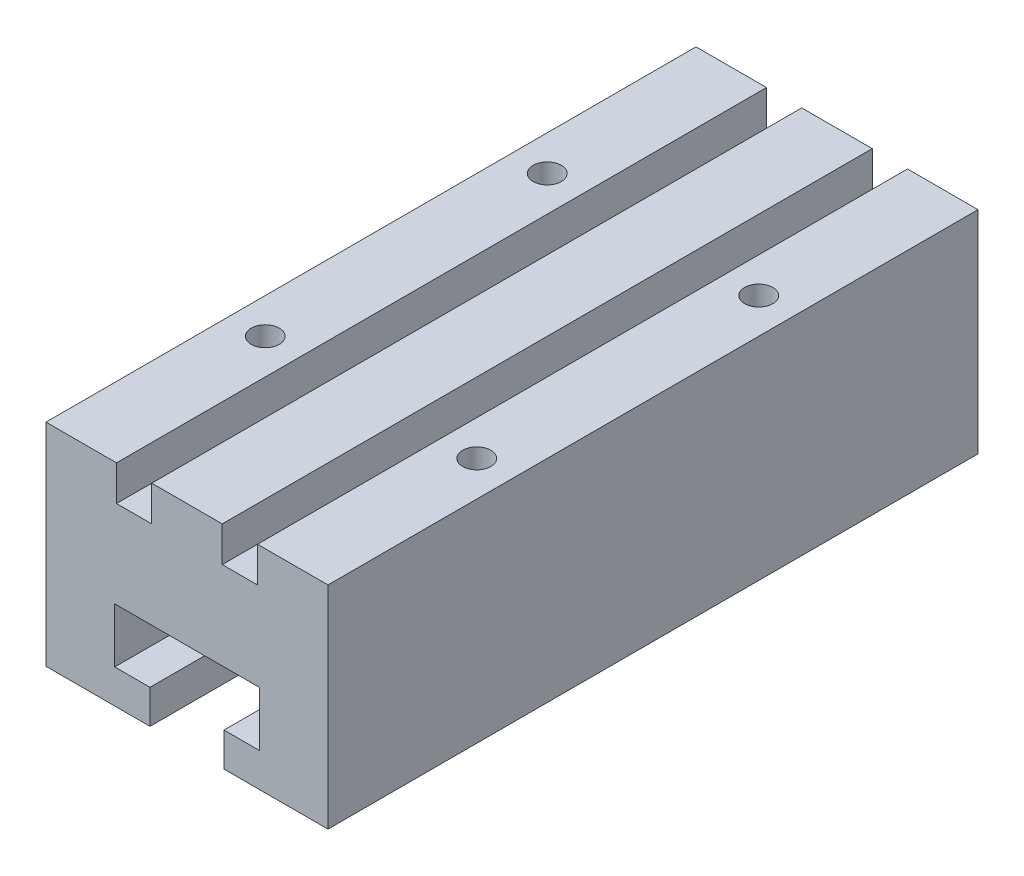
ISO-10303-21;
HEADER;
FILE_DESCRIPTION(('STEP AP214'),'2;1');
FILE_NAME('part.step','',(''),(''),'','','');
FILE_SCHEMA(('AUTOMOTIVE_DESIGN { 1 0 10303 214 1 1 1 1 }'));
ENDSEC;
DATA;
#1=APPLICATION_CONTEXT('core data for automotive mechanical design processes');
#2=APPLICATION_PROTOCOL_DEFINITION('international standard','automotive_design',2000,#1);
#3=PRODUCT_CONTEXT('',#1,'mechanical');
#4=PRODUCT('Part','Part','',(#3));
#5=PRODUCT_RELATED_PRODUCT_CATEGORY('part','',(#4));
#6=PRODUCT_DEFINITION_FORMATION('','',#4);
#7=PRODUCT_DEFINITION_CONTEXT('part definition',#1,'design');
#8=PRODUCT_DEFINITION('design','',#6,#7);
#9=PRODUCT_DEFINITION_SHAPE('','',#8);
#10=(LENGTH_UNIT() NAMED_UNIT(*) SI_UNIT(.MILLI.,.METRE.));
#11=(NAMED_UNIT(*) PLANE_ANGLE_UNIT() SI_UNIT($,.RADIAN.));
#12=(NAMED_UNIT(*) SI_UNIT($,.STERADIAN.) SOLID_ANGLE_UNIT());
#13=UNCERTAINTY_MEASURE_WITH_UNIT(LENGTH_MEASURE(1.E-05),#10,'distance_accuracy_value','');
#14=(GEOMETRIC_REPRESENTATION_CONTEXT(3) GLOBAL_UNCERTAINTY_ASSIGNED_CONTEXT((#13)) GLOBAL_UNIT_ASSIGNED_CONTEXT((#10,
#11,#12)) REPRESENTATION_CONTEXT('',''));
#15=CARTESIAN_POINT('',(0.,0.,0.));
#16=DIRECTION('',(0.,0.,1.));
#17=DIRECTION('',(1.,0.,0.));
#18=AXIS2_PLACEMENT_3D('',#15,#16,#17);
#19=CARTESIAN_POINT('',(-20.,15.,92.2));
#20=DIRECTION('',(0.,-1.,0.));
#21=DIRECTION('',(0.,0.,-1.));
#22=AXIS2_PLACEMENT_3D('',#19,#20,#21);
#23=PLANE('',#22);
#24=DIRECTION('',(-1.,0.,0.));
#25=VECTOR('',#24,1.);
#26=CARTESIAN_POINT('',(-20.,15.,0.));
#27=LINE('',#26,#25);
#28=CARTESIAN_POINT('',(5.,15.,0.));
#29=VERTEX_POINT('',#28);
#30=CARTESIAN_POINT('',(-5.,15.,0.));
#31=VERTEX_POINT('',#30);
#32=EDGE_CURVE('E311',#29,#31,#27,.T.);
#33=ORIENTED_EDGE('',*,*,#32,.T.);
#34=DIRECTION('',(0.,0.,-1.));
#35=VECTOR('',#34,1.);
#36=CARTESIAN_POINT('',(-4.99999999999999,15.,92.2));
#37=LINE('',#36,#35);
#38=CARTESIAN_POINT('',(-4.99999999999999,15.,92.2));
#39=VERTEX_POINT('',#38);
#40=EDGE_CURVE('E222',#39,#31,#37,.T.);
#41=ORIENTED_EDGE('',*,*,#40,.F.);
#42=DIRECTION('',(-1.,0.,0.));
#43=VECTOR('',#42,1.);
#44=CARTESIAN_POINT('',(-20.,15.,92.2));
#45=LINE('',#44,#43);
#46=CARTESIAN_POINT('',(5.00000000000001,15.,92.2));
#47=VERTEX_POINT('',#46);
#48=EDGE_CURVE('E298',#47,#39,#45,.T.);
#49=ORIENTED_EDGE('',*,*,#48,.F.);
#50=DIRECTION('',(0.,0.,1.));
#51=VECTOR('',#50,1.);
#52=CARTESIAN_POINT('',(5.,15.,0.));
#53=LINE('',#52,#51);
#54=EDGE_CURVE('E216',#29,#47,#53,.T.);
#55=ORIENTED_EDGE('',*,*,#54,.F.);
#56=EDGE_LOOP('',(#33,#41,#49,#55));
#57=FACE_BOUND('',#56,.T.);
#58=ADVANCED_FACE('F41',(#57),#23,.F.);
#59=CARTESIAN_POINT('',(-15.,15.,66.1));
#60=DIRECTION('',(0.,1.,0.));
#61=DIRECTION('',(0.,0.,1.));
#62=AXIS2_PLACEMENT_3D('',#59,#60,#61);
#63=CIRCLE('',#62,2.);
#64=CARTESIAN_POINT('',(-15.,15.,68.1));
#65=VERTEX_POINT('',#64);
#66=EDGE_CURVE('E372',#65,#65,#63,.T.);
#67=ORIENTED_EDGE('',*,*,#66,.F.);
#68=EDGE_LOOP('',(#67));
#69=FACE_BOUND('',#68,.T.);
#70=CARTESIAN_POINT('',(-15.,15.,26.1));
#71=DIRECTION('',(0.,1.,0.));
#72=DIRECTION('',(0.,0.,1.));
#73=AXIS2_PLACEMENT_3D('',#70,#71,#72);
#74=CIRCLE('',#73,2.);
#75=CARTESIAN_POINT('',(-15.,15.,28.1));
#76=VERTEX_POINT('',#75);
#77=EDGE_CURVE('E354',#76,#76,#74,.T.);
#78=ORIENTED_EDGE('',*,*,#77,.F.);
#79=EDGE_LOOP('',(#78));
#80=FACE_BOUND('',#79,.T.);
#81=CARTESIAN_POINT('',(-10.,15.,92.2));
#82=VERTEX_POINT('',#81);
#83=CARTESIAN_POINT('',(-20.,15.,92.2));
#84=VERTEX_POINT('',#83);
#85=EDGE_CURVE('E292',#82,#84,#45,.T.);
#86=ORIENTED_EDGE('',*,*,#85,.F.);
#87=DIRECTION('',(0.,0.,1.));
#88=VECTOR('',#87,1.);
#89=CARTESIAN_POINT('',(-10.,15.,92.2));
#90=LINE('',#89,#88);
#91=CARTESIAN_POINT('',(-10.,15.,0.));
#92=VERTEX_POINT('',#91);
#93=EDGE_CURVE('E347',#92,#82,#90,.T.);
#94=ORIENTED_EDGE('',*,*,#93,.F.);
#95=CARTESIAN_POINT('',(-20.,15.,0.));
#96=VERTEX_POINT('',#95);
#97=EDGE_CURVE('E198',#92,#96,#27,.T.);
#98=ORIENTED_EDGE('',*,*,#97,.T.);
#99=DIRECTION('',(0.,0.,-1.));
#100=VECTOR('',#99,1.);
#101=CARTESIAN_POINT('',(-20.,15.,92.2));
#102=LINE('',#101,#100);
#103=EDGE_CURVE('E49',#84,#96,#102,.T.);
#104=ORIENTED_EDGE('',*,*,#103,.F.);
#105=EDGE_LOOP('',(#86,#94,#98,#104));
#106=FACE_BOUND('',#105,.T.);
#107=ADVANCED_FACE('F387',(#69,#80,#106),#23,.F.);
#108=CARTESIAN_POINT('',(-20.,-15.,92.2));
#109=DIRECTION('',(0.,1.,0.));
#110=DIRECTION('',(0.,0.,1.));
#111=AXIS2_PLACEMENT_3D('',#108,#109,#110);
#112=PLANE('',#111);
#113=DIRECTION('',(1.,0.,0.));
#114=VECTOR('',#113,1.);
#115=CARTESIAN_POINT('',(-20.,-15.,92.2));
#116=LINE('',#115,#114);
#117=CARTESIAN_POINT('',(5.25,-15.,92.2));
#118=VERTEX_POINT('',#117);
#119=CARTESIAN_POINT('',(20.,-15.,92.2));
#120=VERTEX_POINT('',#119);
#121=EDGE_CURVE('E300',#118,#120,#116,.T.);
#122=ORIENTED_EDGE('',*,*,#121,.F.);
#123=DIRECTION('',(0.,0.,1.));
#124=VECTOR('',#123,1.);
#125=CARTESIAN_POINT('',(5.25,-15.,0.));
#126=LINE('',#125,#124);
#127=CARTESIAN_POINT('',(5.25,-15.,0.));
#128=VERTEX_POINT('',#127);
#129=EDGE_CURVE('E279',#128,#118,#126,.T.);
#130=ORIENTED_EDGE('',*,*,#129,.F.);
#131=DIRECTION('',(1.,0.,0.));
#132=VECTOR('',#131,1.);
#133=CARTESIAN_POINT('',(-20.,-15.,0.));
#134=LINE('',#133,#132);
#135=CARTESIAN_POINT('',(20.,-15.,0.));
#136=VERTEX_POINT('',#135);
#137=EDGE_CURVE('E313',#128,#136,#134,.T.);
#138=ORIENTED_EDGE('',*,*,#137,.T.);
#139=DIRECTION('',(0.,0.,-1.));
#140=VECTOR('',#139,1.);
#141=CARTESIAN_POINT('',(20.,-15.,92.2));
#142=LINE('',#141,#140);
#143=EDGE_CURVE('E304',#120,#136,#142,.T.);
#144=ORIENTED_EDGE('',*,*,#143,.F.);
#145=EDGE_LOOP('',(#122,#130,#138,#144));
#146=FACE_BOUND('',#145,.T.);
#147=ADVANCED_FACE('F390',(#146),#112,.F.);
#148=CARTESIAN_POINT('',(20.,-15.,92.2));
#149=DIRECTION('',(-1.,0.,0.));
#150=DIRECTION('',(0.,0.,1.));
#151=AXIS2_PLACEMENT_3D('',#148,#149,#150);
#152=PLANE('',#151);
#153=DIRECTION('',(0.,1.,0.));
#154=VECTOR('',#153,1.);
#155=CARTESIAN_POINT('',(20.,-15.,0.));
#156=LINE('',#155,#154);
#157=CARTESIAN_POINT('',(20.,15.,0.));
#158=VERTEX_POINT('',#157);
#159=EDGE_CURVE('E274',#136,#158,#156,.T.);
#160=ORIENTED_EDGE('',*,*,#159,.T.);
#161=DIRECTION('',(0.,0.,-1.));
#162=VECTOR('',#161,1.);
#163=CARTESIAN_POINT('',(20.,15.,92.2));
#164=LINE('',#163,#162);
#165=CARTESIAN_POINT('',(20.,15.,92.2));
#166=VERTEX_POINT('',#165);
#167=EDGE_CURVE('E11',#166,#158,#164,.T.);
#168=ORIENTED_EDGE('',*,*,#167,.F.);
#169=DIRECTION('',(0.,1.,0.));
#170=VECTOR('',#169,1.);
#171=CARTESIAN_POINT('',(20.,-15.,92.2));
#172=LINE('',#171,#170);
#173=EDGE_CURVE('E289',#120,#166,#172,.T.);
#174=ORIENTED_EDGE('',*,*,#173,.F.);
#175=ORIENTED_EDGE('',*,*,#143,.T.);
#176=EDGE_LOOP('',(#160,#168,#174,#175));
#177=FACE_BOUND('',#176,.T.);
#178=ADVANCED_FACE('F43',(#177),#152,.F.);
#179=CARTESIAN_POINT('',(15.,15.,26.1));
#180=DIRECTION('',(0.,1.,0.));
#181=DIRECTION('',(0.,0.,-1.));
#182=AXIS2_PLACEMENT_3D('',#179,#180,#181);
#183=CIRCLE('',#182,2.);
#184=CARTESIAN_POINT('',(15.,15.,24.1));
#185=VERTEX_POINT('',#184);
#186=EDGE_CURVE('E360',#185,#185,#183,.T.);
#187=ORIENTED_EDGE('',*,*,#186,.F.);
#188=EDGE_LOOP('',(#187));
#189=FACE_BOUND('',#188,.T.);
#190=CARTESIAN_POINT('',(15.,15.,66.1));
#191=DIRECTION('',(0.,1.,0.));
#192=DIRECTION('',(0.,0.,-1.));
#193=AXIS2_PLACEMENT_3D('',#190,#191,#192);
#194=CIRCLE('',#193,2.);
#195=CARTESIAN_POINT('',(15.,15.,64.1));
#196=VERTEX_POINT('',#195);
#197=EDGE_CURVE('E366',#196,#196,#194,.T.);
#198=ORIENTED_EDGE('',*,*,#197,.F.);
#199=EDGE_LOOP('',(#198));
#200=FACE_BOUND('',#199,.T.);
#201=CARTESIAN_POINT('',(10.,15.,0.));
#202=VERTEX_POINT('',#201);
#203=EDGE_CURVE('E307',#158,#202,#27,.T.);
#204=ORIENTED_EDGE('',*,*,#203,.T.);
#205=DIRECTION('',(0.,0.,-1.));
#206=VECTOR('',#205,1.);
#207=CARTESIAN_POINT('',(10.,15.,0.));
#208=LINE('',#207,#206);
#209=CARTESIAN_POINT('',(10.,15.,92.2));
#210=VERTEX_POINT('',#209);
#211=EDGE_CURVE('E210',#210,#202,#208,.T.);
#212=ORIENTED_EDGE('',*,*,#211,.F.);
#213=EDGE_CURVE('E294',#166,#210,#45,.T.);
#214=ORIENTED_EDGE('',*,*,#213,.F.);
#215=ORIENTED_EDGE('',*,*,#167,.T.);
#216=EDGE_LOOP('',(#204,#212,#214,#215));
#217=FACE_BOUND('',#216,.T.);
#218=ADVANCED_FACE('F391',(#189,#200,#217),#23,.F.);
#219=CARTESIAN_POINT('',(-20.,-15.,92.2));
#220=DIRECTION('',(1.,0.,0.));
#221=DIRECTION('',(0.,0.,-1.));
#222=AXIS2_PLACEMENT_3D('',#219,#220,#221);
#223=PLANE('',#222);
#224=DIRECTION('',(0.,-1.,0.));
#225=VECTOR('',#224,1.);
#226=CARTESIAN_POINT('',(-20.,-15.,0.));
#227=LINE('',#226,#225);
#228=CARTESIAN_POINT('',(-20.,-15.,0.));
#229=VERTEX_POINT('',#228);
#230=EDGE_CURVE('E310',#96,#229,#227,.T.);
#231=ORIENTED_EDGE('',*,*,#230,.T.);
#232=DIRECTION('',(0.,0.,-1.));
#233=VECTOR('',#232,1.);
#234=CARTESIAN_POINT('',(-20.,-15.,92.2));
#235=LINE('',#234,#233);
#236=CARTESIAN_POINT('',(-20.,-15.,92.2));
#237=VERTEX_POINT('',#236);
#238=EDGE_CURVE('E318',#237,#229,#235,.T.);
#239=ORIENTED_EDGE('',*,*,#238,.F.);
#240=DIRECTION('',(0.,-1.,0.));
#241=VECTOR('',#240,1.);
#242=CARTESIAN_POINT('',(-20.,-15.,92.2));
#243=LINE('',#242,#241);
#244=EDGE_CURVE('E297',#84,#237,#243,.T.);
#245=ORIENTED_EDGE('',*,*,#244,.F.);
#246=ORIENTED_EDGE('',*,*,#103,.T.);
#247=EDGE_LOOP('',(#231,#239,#245,#246));
#248=FACE_BOUND('',#247,.T.);
#249=ADVANCED_FACE('F324',(#248),#223,.F.);
#250=CARTESIAN_POINT('',(-5.25,-15.,0.));
#251=VERTEX_POINT('',#250);
#252=EDGE_CURVE('E293',#229,#251,#134,.T.);
#253=ORIENTED_EDGE('',*,*,#252,.T.);
#254=DIRECTION('',(0.,0.,1.));
#255=VECTOR('',#254,1.);
#256=CARTESIAN_POINT('',(-5.25,-15.,0.));
#257=LINE('',#256,#255);
#258=CARTESIAN_POINT('',(-5.25,-15.,92.2));
#259=VERTEX_POINT('',#258);
#260=EDGE_CURVE('E281',#251,#259,#257,.T.);
#261=ORIENTED_EDGE('',*,*,#260,.T.);
#262=EDGE_CURVE('E301',#237,#259,#116,.T.);
#263=ORIENTED_EDGE('',*,*,#262,.F.);
#264=ORIENTED_EDGE('',*,*,#238,.T.);
#265=EDGE_LOOP('',(#253,#261,#263,#264));
#266=FACE_BOUND('',#265,.T.);
#267=ADVANCED_FACE('F331',(#266),#112,.F.);
#268=CARTESIAN_POINT('',(0.,0.,92.2));
#269=DIRECTION('',(0.,0.,-1.));
#270=DIRECTION('',(-1.,0.,0.));
#271=AXIS2_PLACEMENT_3D('',#268,#269,#270);
#272=PLANE('',#271);
#273=ORIENTED_EDGE('',*,*,#48,.T.);
#274=DIRECTION('',(0.,1.,0.));
#275=VECTOR('',#274,1.);
#276=CARTESIAN_POINT('',(-4.99999999999999,10.,92.2));
#277=LINE('',#276,#275);
#278=CARTESIAN_POINT('',(-4.99999999999999,10.,92.2));
#279=VERTEX_POINT('',#278);
#280=EDGE_CURVE('E201',#279,#39,#277,.T.);
#281=ORIENTED_EDGE('',*,*,#280,.F.);
#282=DIRECTION('',(1.,0.,0.));
#283=VECTOR('',#282,1.);
#284=CARTESIAN_POINT('',(-4.99999999999999,10.,92.2));
#285=LINE('',#284,#283);
#286=CARTESIAN_POINT('',(-10.,10.,92.2));
#287=VERTEX_POINT('',#286);
#288=EDGE_CURVE('E187',#287,#279,#285,.T.);
#289=ORIENTED_EDGE('',*,*,#288,.F.);
#290=DIRECTION('',(0.,1.,0.));
#291=VECTOR('',#290,1.);
#292=CARTESIAN_POINT('',(-10.,10.,92.2));
#293=LINE('',#292,#291);
#294=EDGE_CURVE('E185',#287,#82,#293,.T.);
#295=ORIENTED_EDGE('',*,*,#294,.T.);
#296=ORIENTED_EDGE('',*,*,#85,.T.);
#297=ORIENTED_EDGE('',*,*,#244,.T.);
#298=ORIENTED_EDGE('',*,*,#262,.T.);
#299=DIRECTION('',(0.,-1.,0.));
#300=VECTOR('',#299,1.);
#301=CARTESIAN_POINT('',(-5.25,-10.2,92.2));
#302=LINE('',#301,#300);
#303=CARTESIAN_POINT('',(-5.25,-10.2,92.2));
#304=VERTEX_POINT('',#303);
#305=EDGE_CURVE('E262',#304,#259,#302,.T.);
#306=ORIENTED_EDGE('',*,*,#305,.F.);
#307=DIRECTION('',(1.,0.,0.));
#308=VECTOR('',#307,1.);
#309=CARTESIAN_POINT('',(-10.25,-10.2,92.2));
#310=LINE('',#309,#308);
#311=CARTESIAN_POINT('',(-10.25,-10.2,92.2));
#312=VERTEX_POINT('',#311);
#313=EDGE_CURVE('E259',#312,#304,#310,.T.);
#314=ORIENTED_EDGE('',*,*,#313,.F.);
#315=DIRECTION('',(0.,-1.,0.));
#316=VECTOR('',#315,1.);
#317=CARTESIAN_POINT('',(-10.25,-2.45,92.2));
#318=LINE('',#317,#316);
#319=CARTESIAN_POINT('',(-10.25,-2.45,92.2));
#320=VERTEX_POINT('',#319);
#321=EDGE_CURVE('E256',#320,#312,#318,.T.);
#322=ORIENTED_EDGE('',*,*,#321,.F.);
#323=DIRECTION('',(-1.,0.,0.));
#324=VECTOR('',#323,1.);
#325=CARTESIAN_POINT('',(-10.25,-2.45,92.2));
#326=LINE('',#325,#324);
#327=CARTESIAN_POINT('',(10.25,-2.45,92.2));
#328=VERTEX_POINT('',#327);
#329=EDGE_CURVE('E253',#328,#320,#326,.T.);
#330=ORIENTED_EDGE('',*,*,#329,.F.);
#331=DIRECTION('',(0.,1.,0.));
#332=VECTOR('',#331,1.);
#333=CARTESIAN_POINT('',(10.25,-2.45,92.2));
#334=LINE('',#333,#332);
#335=CARTESIAN_POINT('',(10.25,-10.2,92.2));
#336=VERTEX_POINT('',#335);
#337=EDGE_CURVE('E234',#336,#328,#334,.T.);
#338=ORIENTED_EDGE('',*,*,#337,.F.);
#339=DIRECTION('',(1.,0.,0.));
#340=VECTOR('',#339,1.);
#341=CARTESIAN_POINT('',(10.25,-10.2,92.2));
#342=LINE('',#341,#340);
#343=CARTESIAN_POINT('',(5.25,-10.2,92.2));
#344=VERTEX_POINT('',#343);
#345=EDGE_CURVE('E267',#344,#336,#342,.T.);
#346=ORIENTED_EDGE('',*,*,#345,.F.);
#347=DIRECTION('',(0.,1.,0.));
#348=VECTOR('',#347,1.);
#349=CARTESIAN_POINT('',(5.25,-10.2,92.2));
#350=LINE('',#349,#348);
#351=EDGE_CURVE('E264',#118,#344,#350,.T.);
#352=ORIENTED_EDGE('',*,*,#351,.F.);
#353=ORIENTED_EDGE('',*,*,#121,.T.);
#354=ORIENTED_EDGE('',*,*,#173,.T.);
#355=ORIENTED_EDGE('',*,*,#213,.T.);
#356=DIRECTION('',(0.,1.,0.));
#357=VECTOR('',#356,1.);
#358=CARTESIAN_POINT('',(10.,10.,92.2));
#359=LINE('',#358,#357);
#360=CARTESIAN_POINT('',(10.,10.,92.2));
#361=VERTEX_POINT('',#360);
#362=EDGE_CURVE('E226',#361,#210,#359,.T.);
#363=ORIENTED_EDGE('',*,*,#362,.F.);
#364=DIRECTION('',(1.,0.,0.));
#365=VECTOR('',#364,1.);
#366=CARTESIAN_POINT('',(5.00000000000001,10.,92.2));
#367=LINE('',#366,#365);
#368=CARTESIAN_POINT('',(5.00000000000001,10.,92.2));
#369=VERTEX_POINT('',#368);
#370=EDGE_CURVE('E209',#369,#361,#367,.T.);
#371=ORIENTED_EDGE('',*,*,#370,.F.);
#372=DIRECTION('',(0.,1.,0.));
#373=VECTOR('',#372,1.);
#374=CARTESIAN_POINT('',(5.00000000000001,10.,92.2));
#375=LINE('',#374,#373);
#376=EDGE_CURVE('E215',#369,#47,#375,.T.);
#377=ORIENTED_EDGE('',*,*,#376,.T.);
#378=EDGE_LOOP('',(#273,#281,#289,#295,#296,#297,#298,#306,#314,#322,#330,#338,#346,#352,#353,
#354,#355,#363,#371,#377));
#379=FACE_BOUND('',#378,.T.);
#380=ADVANCED_FACE('F336',(#379),#272,.F.);
#381=CARTESIAN_POINT('',(0.,0.,0.));
#382=DIRECTION('',(0.,0.,-1.));
#383=DIRECTION('',(-1.,0.,0.));
#384=AXIS2_PLACEMENT_3D('',#381,#382,#383);
#385=PLANE('',#384);
#386=DIRECTION('',(0.,1.,0.));
#387=VECTOR('',#386,1.);
#388=CARTESIAN_POINT('',(-5.,10.,0.));
#389=LINE('',#388,#387);
#390=CARTESIAN_POINT('',(-4.99999999999999,10.,0.));
#391=VERTEX_POINT('',#390);
#392=EDGE_CURVE('E199',#391,#31,#389,.T.);
#393=ORIENTED_EDGE('',*,*,#392,.T.);
#394=ORIENTED_EDGE('',*,*,#32,.F.);
#395=DIRECTION('',(0.,1.,0.));
#396=VECTOR('',#395,1.);
#397=CARTESIAN_POINT('',(5.,10.,0.));
#398=LINE('',#397,#396);
#399=CARTESIAN_POINT('',(5.,10.,0.));
#400=VERTEX_POINT('',#399);
#401=EDGE_CURVE('E220',#400,#29,#398,.T.);
#402=ORIENTED_EDGE('',*,*,#401,.F.);
#403=DIRECTION('',(-1.,0.,0.));
#404=VECTOR('',#403,1.);
#405=CARTESIAN_POINT('',(5.,10.,0.));
#406=LINE('',#405,#404);
#407=CARTESIAN_POINT('',(10.,10.,0.));
#408=VERTEX_POINT('',#407);
#409=EDGE_CURVE('E213',#408,#400,#406,.T.);
#410=ORIENTED_EDGE('',*,*,#409,.F.);
#411=DIRECTION('',(0.,1.,0.));
#412=VECTOR('',#411,1.);
#413=CARTESIAN_POINT('',(10.,10.,0.));
#414=LINE('',#413,#412);
#415=EDGE_CURVE('E223',#408,#202,#414,.T.);
#416=ORIENTED_EDGE('',*,*,#415,.T.);
#417=ORIENTED_EDGE('',*,*,#203,.F.);
#418=ORIENTED_EDGE('',*,*,#159,.F.);
#419=ORIENTED_EDGE('',*,*,#137,.F.);
#420=DIRECTION('',(0.,1.,0.));
#421=VECTOR('',#420,1.);
#422=CARTESIAN_POINT('',(5.25,-10.2,0.));
#423=LINE('',#422,#421);
#424=CARTESIAN_POINT('',(5.25,-10.2,0.));
#425=VERTEX_POINT('',#424);
#426=EDGE_CURVE('E243',#128,#425,#423,.T.);
#427=ORIENTED_EDGE('',*,*,#426,.T.);
#428=DIRECTION('',(1.,0.,0.));
#429=VECTOR('',#428,1.);
#430=CARTESIAN_POINT('',(10.25,-10.2,0.));
#431=LINE('',#430,#429);
#432=CARTESIAN_POINT('',(10.25,-10.2,0.));
#433=VERTEX_POINT('',#432);
#434=EDGE_CURVE('E246',#425,#433,#431,.T.);
#435=ORIENTED_EDGE('',*,*,#434,.T.);
#436=DIRECTION('',(0.,1.,0.));
#437=VECTOR('',#436,1.);
#438=CARTESIAN_POINT('',(10.25,-2.45,0.));
#439=LINE('',#438,#437);
#440=CARTESIAN_POINT('',(10.25,-2.45,0.));
#441=VERTEX_POINT('',#440);
#442=EDGE_CURVE('E249',#433,#441,#439,.T.);
#443=ORIENTED_EDGE('',*,*,#442,.T.);
#444=DIRECTION('',(-1.,0.,0.));
#445=VECTOR('',#444,1.);
#446=CARTESIAN_POINT('',(-10.25,-2.45,0.));
#447=LINE('',#446,#445);
#448=CARTESIAN_POINT('',(-10.25,-2.45,0.));
#449=VERTEX_POINT('',#448);
#450=EDGE_CURVE('E230',#441,#449,#447,.T.);
#451=ORIENTED_EDGE('',*,*,#450,.T.);
#452=DIRECTION('',(0.,-1.,0.));
#453=VECTOR('',#452,1.);
#454=CARTESIAN_POINT('',(-10.25,-2.45,0.));
#455=LINE('',#454,#453);
#456=CARTESIAN_POINT('',(-10.25,-10.2,0.));
#457=VERTEX_POINT('',#456);
#458=EDGE_CURVE('E233',#449,#457,#455,.T.);
#459=ORIENTED_EDGE('',*,*,#458,.T.);
#460=DIRECTION('',(1.,0.,0.));
#461=VECTOR('',#460,1.);
#462=CARTESIAN_POINT('',(-10.25,-10.2,0.));
#463=LINE('',#462,#461);
#464=CARTESIAN_POINT('',(-5.25,-10.2,0.));
#465=VERTEX_POINT('',#464);
#466=EDGE_CURVE('E237',#457,#465,#463,.T.);
#467=ORIENTED_EDGE('',*,*,#466,.T.);
#468=DIRECTION('',(0.,-1.,0.));
#469=VECTOR('',#468,1.);
#470=CARTESIAN_POINT('',(-5.25,-10.2,0.));
#471=LINE('',#470,#469);
#472=EDGE_CURVE('E240',#465,#251,#471,.T.);
#473=ORIENTED_EDGE('',*,*,#472,.T.);
#474=ORIENTED_EDGE('',*,*,#252,.F.);
#475=ORIENTED_EDGE('',*,*,#230,.F.);
#476=ORIENTED_EDGE('',*,*,#97,.F.);
#477=DIRECTION('',(0.,1.,0.));
#478=VECTOR('',#477,1.);
#479=CARTESIAN_POINT('',(-10.,10.,0.));
#480=LINE('',#479,#478);
#481=CARTESIAN_POINT('',(-10.,10.,0.));
#482=VERTEX_POINT('',#481);
#483=EDGE_CURVE('E182',#482,#92,#480,.T.);
#484=ORIENTED_EDGE('',*,*,#483,.F.);
#485=DIRECTION('',(-1.,0.,0.));
#486=VECTOR('',#485,1.);
#487=CARTESIAN_POINT('',(-5.,10.,0.));
#488=LINE('',#487,#486);
#489=EDGE_CURVE('E188',#391,#482,#488,.T.);
#490=ORIENTED_EDGE('',*,*,#489,.F.);
#491=EDGE_LOOP('',(#393,#394,#402,#410,#416,#417,#418,#419,#427,#435,#443,#451,#459,#467,#473,
#474,#475,#476,#484,#490));
#492=FACE_BOUND('',#491,.T.);
#493=ADVANCED_FACE('F196',(#492),#385,.T.);
#494=CARTESIAN_POINT('',(-10.25,-2.45,0.));
#495=DIRECTION('',(0.,1.,0.));
#496=DIRECTION('',(-1.,0.,0.));
#497=AXIS2_PLACEMENT_3D('',#494,#495,#496);
#498=PLANE('',#497);
#499=ORIENTED_EDGE('',*,*,#329,.T.);
#500=DIRECTION('',(0.,0.,1.));
#501=VECTOR('',#500,1.);
#502=CARTESIAN_POINT('',(-10.25,-2.45,0.));
#503=LINE('',#502,#501);
#504=EDGE_CURVE('E252',#449,#320,#503,.T.);
#505=ORIENTED_EDGE('',*,*,#504,.F.);
#506=ORIENTED_EDGE('',*,*,#450,.F.);
#507=DIRECTION('',(0.,0.,1.));
#508=VECTOR('',#507,1.);
#509=CARTESIAN_POINT('',(10.25,-2.45,0.));
#510=LINE('',#509,#508);
#511=EDGE_CURVE('E272',#441,#328,#510,.T.);
#512=ORIENTED_EDGE('',*,*,#511,.T.);
#513=EDGE_LOOP('',(#499,#505,#506,#512));
#514=FACE_BOUND('',#513,.T.);
#515=ADVANCED_FACE('F453',(#514),#498,.F.);
#516=CARTESIAN_POINT('',(10.25,-2.45,0.));
#517=DIRECTION('',(1.,0.,0.));
#518=DIRECTION('',(0.,0.,-1.));
#519=AXIS2_PLACEMENT_3D('',#516,#517,#518);
#520=PLANE('',#519);
#521=ORIENTED_EDGE('',*,*,#337,.T.);
#522=ORIENTED_EDGE('',*,*,#511,.F.);
#523=ORIENTED_EDGE('',*,*,#442,.F.);
#524=DIRECTION('',(0.,0.,1.));
#525=VECTOR('',#524,1.);
#526=CARTESIAN_POINT('',(10.25,-10.2,0.));
#527=LINE('',#526,#525);
#528=EDGE_CURVE('E275',#433,#336,#527,.T.);
#529=ORIENTED_EDGE('',*,*,#528,.T.);
#530=EDGE_LOOP('',(#521,#522,#523,#529));
#531=FACE_BOUND('',#530,.T.);
#532=ADVANCED_FACE('F449',(#531),#520,.F.);
#533=CARTESIAN_POINT('',(10.25,-10.2,0.));
#534=DIRECTION('',(0.,-1.,0.));
#535=DIRECTION('',(1.,0.,0.));
#536=AXIS2_PLACEMENT_3D('',#533,#534,#535);
#537=PLANE('',#536);
#538=ORIENTED_EDGE('',*,*,#345,.T.);
#539=ORIENTED_EDGE('',*,*,#528,.F.);
#540=ORIENTED_EDGE('',*,*,#434,.F.);
#541=DIRECTION('',(0.,0.,1.));
#542=VECTOR('',#541,1.);
#543=CARTESIAN_POINT('',(5.25,-10.2,0.));
#544=LINE('',#543,#542);
#545=EDGE_CURVE('E277',#425,#344,#544,.T.);
#546=ORIENTED_EDGE('',*,*,#545,.T.);
#547=EDGE_LOOP('',(#538,#539,#540,#546));
#548=FACE_BOUND('',#547,.T.);
#549=ADVANCED_FACE('F445',(#548),#537,.F.);
#550=CARTESIAN_POINT('',(5.25,-10.2,0.));
#551=DIRECTION('',(1.,0.,0.));
#552=DIRECTION('',(0.,1.,0.));
#553=AXIS2_PLACEMENT_3D('',#550,#551,#552);
#554=PLANE('',#553);
#555=ORIENTED_EDGE('',*,*,#351,.T.);
#556=ORIENTED_EDGE('',*,*,#545,.F.);
#557=ORIENTED_EDGE('',*,*,#426,.F.);
#558=ORIENTED_EDGE('',*,*,#129,.T.);
#559=EDGE_LOOP('',(#555,#556,#557,#558));
#560=FACE_BOUND('',#559,.T.);
#561=ADVANCED_FACE('F442',(#560),#554,.F.);
#562=CARTESIAN_POINT('',(-5.25,-10.2,0.));
#563=DIRECTION('',(-1.,0.,0.));
#564=DIRECTION('',(0.,-1.,0.));
#565=AXIS2_PLACEMENT_3D('',#562,#563,#564);
#566=PLANE('',#565);
#567=ORIENTED_EDGE('',*,*,#305,.T.);
#568=ORIENTED_EDGE('',*,*,#260,.F.);
#569=ORIENTED_EDGE('',*,*,#472,.F.);
#570=DIRECTION('',(0.,0.,1.));
#571=VECTOR('',#570,1.);
#572=CARTESIAN_POINT('',(-5.25,-10.2,0.));
#573=LINE('',#572,#571);
#574=EDGE_CURVE('E284',#465,#304,#573,.T.);
#575=ORIENTED_EDGE('',*,*,#574,.T.);
#576=EDGE_LOOP('',(#567,#568,#569,#575));
#577=FACE_BOUND('',#576,.T.);
#578=ADVANCED_FACE('F462',(#577),#566,.F.);
#579=CARTESIAN_POINT('',(-10.25,-10.2,0.));
#580=DIRECTION('',(0.,-1.,0.));
#581=DIRECTION('',(1.,0.,0.));
#582=AXIS2_PLACEMENT_3D('',#579,#580,#581);
#583=PLANE('',#582);
#584=ORIENTED_EDGE('',*,*,#313,.T.);
#585=ORIENTED_EDGE('',*,*,#574,.F.);
#586=ORIENTED_EDGE('',*,*,#466,.F.);
#587=DIRECTION('',(0.,0.,1.));
#588=VECTOR('',#587,1.);
#589=CARTESIAN_POINT('',(-10.25,-10.2,0.));
#590=LINE('',#589,#588);
#591=EDGE_CURVE('E286',#457,#312,#590,.T.);
#592=ORIENTED_EDGE('',*,*,#591,.T.);
#593=EDGE_LOOP('',(#584,#585,#586,#592));
#594=FACE_BOUND('',#593,.T.);
#595=ADVANCED_FACE('F460',(#594),#583,.F.);
#596=CARTESIAN_POINT('',(-10.25,-2.45,0.));
#597=DIRECTION('',(-1.,0.,0.));
#598=DIRECTION('',(0.,0.,1.));
#599=AXIS2_PLACEMENT_3D('',#596,#597,#598);
#600=PLANE('',#599);
#601=ORIENTED_EDGE('',*,*,#321,.T.);
#602=ORIENTED_EDGE('',*,*,#591,.F.);
#603=ORIENTED_EDGE('',*,*,#458,.F.);
#604=ORIENTED_EDGE('',*,*,#504,.T.);
#605=EDGE_LOOP('',(#601,#602,#603,#604));
#606=FACE_BOUND('',#605,.T.);
#607=ADVANCED_FACE('F458',(#606),#600,.F.);
#608=CARTESIAN_POINT('',(5.,10.,0.));
#609=DIRECTION('',(-1.,0.,0.));
#610=DIRECTION('',(0.,0.,1.));
#611=AXIS2_PLACEMENT_3D('',#608,#609,#610);
#612=PLANE('',#611);
#613=ORIENTED_EDGE('',*,*,#54,.T.);
#614=ORIENTED_EDGE('',*,*,#376,.F.);
#615=DIRECTION('',(0.,0.,1.));
#616=VECTOR('',#615,1.);
#617=CARTESIAN_POINT('',(5.,10.,0.));
#618=LINE('',#617,#616);
#619=EDGE_CURVE('E206',#400,#369,#618,.T.);
#620=ORIENTED_EDGE('',*,*,#619,.F.);
#621=ORIENTED_EDGE('',*,*,#401,.T.);
#622=EDGE_LOOP('',(#613,#614,#620,#621));
#623=FACE_BOUND('',#622,.T.);
#624=ADVANCED_FACE('F475',(#623),#612,.F.);
#625=CARTESIAN_POINT('',(10.,10.,0.));
#626=DIRECTION('',(1.,0.,0.));
#627=DIRECTION('',(0.,0.,-1.));
#628=AXIS2_PLACEMENT_3D('',#625,#626,#627);
#629=PLANE('',#628);
#630=ORIENTED_EDGE('',*,*,#211,.T.);
#631=ORIENTED_EDGE('',*,*,#415,.F.);
#632=DIRECTION('',(0.,0.,-1.));
#633=VECTOR('',#632,1.);
#634=CARTESIAN_POINT('',(10.,10.,0.));
#635=LINE('',#634,#633);
#636=EDGE_CURVE('E64',#361,#408,#635,.T.);
#637=ORIENTED_EDGE('',*,*,#636,.F.);
#638=ORIENTED_EDGE('',*,*,#362,.T.);
#639=EDGE_LOOP('',(#630,#631,#637,#638));
#640=FACE_BOUND('',#639,.T.);
#641=ADVANCED_FACE('F432',(#640),#629,.F.);
#642=CARTESIAN_POINT('',(0.,10.,0.));
#643=DIRECTION('',(0.,1.,0.));
#644=DIRECTION('',(0.,0.,1.));
#645=AXIS2_PLACEMENT_3D('',#642,#643,#644);
#646=PLANE('',#645);
#647=ORIENTED_EDGE('',*,*,#619,.T.);
#648=ORIENTED_EDGE('',*,*,#370,.T.);
#649=ORIENTED_EDGE('',*,*,#636,.T.);
#650=ORIENTED_EDGE('',*,*,#409,.T.);
#651=EDGE_LOOP('',(#647,#648,#649,#650));
#652=FACE_BOUND('',#651,.T.);
#653=ADVANCED_FACE('F551',(#652),#646,.T.);
#654=CARTESIAN_POINT('',(-4.99999999999999,10.,92.2));
#655=DIRECTION('',(1.,0.,0.));
#656=DIRECTION('',(0.,0.,-1.));
#657=AXIS2_PLACEMENT_3D('',#654,#655,#656);
#658=PLANE('',#657);
#659=ORIENTED_EDGE('',*,*,#40,.T.);
#660=ORIENTED_EDGE('',*,*,#392,.F.);
#661=DIRECTION('',(0.,0.,-1.));
#662=VECTOR('',#661,1.);
#663=CARTESIAN_POINT('',(-4.99999999999999,10.,92.2));
#664=LINE('',#663,#662);
#665=EDGE_CURVE('E56',#279,#391,#664,.T.);
#666=ORIENTED_EDGE('',*,*,#665,.F.);
#667=ORIENTED_EDGE('',*,*,#280,.T.);
#668=EDGE_LOOP('',(#659,#660,#666,#667));
#669=FACE_BOUND('',#668,.T.);
#670=ADVANCED_FACE('F351',(#669),#658,.F.);
#671=CARTESIAN_POINT('',(-10.,10.,92.2));
#672=DIRECTION('',(-1.,0.,0.));
#673=DIRECTION('',(0.,0.,1.));
#674=AXIS2_PLACEMENT_3D('',#671,#672,#673);
#675=PLANE('',#674);
#676=ORIENTED_EDGE('',*,*,#93,.T.);
#677=ORIENTED_EDGE('',*,*,#294,.F.);
#678=DIRECTION('',(0.,0.,1.));
#679=VECTOR('',#678,1.);
#680=CARTESIAN_POINT('',(-10.,10.,92.2));
#681=LINE('',#680,#679);
#682=EDGE_CURVE('E179',#482,#287,#681,.T.);
#683=ORIENTED_EDGE('',*,*,#682,.F.);
#684=ORIENTED_EDGE('',*,*,#483,.T.);
#685=EDGE_LOOP('',(#676,#677,#683,#684));
#686=FACE_BOUND('',#685,.T.);
#687=ADVANCED_FACE('F180',(#686),#675,.F.);
#688=CARTESIAN_POINT('',(0.,10.,0.));
#689=DIRECTION('',(0.,1.,0.));
#690=DIRECTION('',(0.,0.,1.));
#691=AXIS2_PLACEMENT_3D('',#688,#689,#690);
#692=PLANE('',#691);
#693=ORIENTED_EDGE('',*,*,#665,.T.);
#694=ORIENTED_EDGE('',*,*,#489,.T.);
#695=ORIENTED_EDGE('',*,*,#682,.T.);
#696=ORIENTED_EDGE('',*,*,#288,.T.);
#697=EDGE_LOOP('',(#693,#694,#695,#696));
#698=FACE_BOUND('',#697,.T.);
#699=ADVANCED_FACE('F191',(#698),#692,.T.);
#700=CARTESIAN_POINT('',(15.,5.,66.1));
#701=DIRECTION('',(0.,1.,0.));
#702=DIRECTION('',(0.,0.,1.));
#703=AXIS2_PLACEMENT_3D('',#700,#701,#702);
#704=CYLINDRICAL_SURFACE('',#703,2.);
#705=CARTESIAN_POINT('',(15.,5.,66.1));
#706=DIRECTION('',(0.,1.,0.));
#707=DIRECTION('',(0.,0.,-1.));
#708=AXIS2_PLACEMENT_3D('',#705,#706,#707);
#709=CIRCLE('',#708,2.);
#710=CARTESIAN_POINT('',(15.,5.,64.1));
#711=VERTEX_POINT('',#710);
#712=EDGE_CURVE('E369',#711,#711,#709,.T.);
#713=ORIENTED_EDGE('',*,*,#712,.F.);
#714=EDGE_LOOP('',(#713));
#715=FACE_BOUND('',#714,.T.);
#716=ORIENTED_EDGE('',*,*,#197,.T.);
#717=EDGE_LOOP('',(#716));
#718=FACE_BOUND('',#717,.T.);
#719=ADVANCED_FACE('F576',(#715,#718),#704,.F.);
#720=CARTESIAN_POINT('',(15.,5.,66.1));
#721=DIRECTION('',(0.,-1.,0.));
#722=DIRECTION('',(0.,0.,-1.));
#723=AXIS2_PLACEMENT_3D('',#720,#721,#722);
#724=PLANE('',#723);
#725=ORIENTED_EDGE('',*,*,#712,.T.);
#726=EDGE_LOOP('',(#725));
#727=FACE_BOUND('',#726,.T.);
#728=ADVANCED_FACE('F582',(#727),#724,.F.);
#729=CARTESIAN_POINT('',(15.,5.,26.1));
#730=DIRECTION('',(0.,1.,0.));
#731=DIRECTION('',(0.,0.,1.));
#732=AXIS2_PLACEMENT_3D('',#729,#730,#731);
#733=CYLINDRICAL_SURFACE('',#732,2.);
#734=CARTESIAN_POINT('',(15.,5.,26.1));
#735=DIRECTION('',(0.,1.,0.));
#736=DIRECTION('',(0.,0.,-1.));
#737=AXIS2_PLACEMENT_3D('',#734,#735,#736);
#738=CIRCLE('',#737,2.);
#739=CARTESIAN_POINT('',(15.,5.,24.1));
#740=VERTEX_POINT('',#739);
#741=EDGE_CURVE('E363',#740,#740,#738,.T.);
#742=ORIENTED_EDGE('',*,*,#741,.F.);
#743=EDGE_LOOP('',(#742));
#744=FACE_BOUND('',#743,.T.);
#745=ORIENTED_EDGE('',*,*,#186,.T.);
#746=EDGE_LOOP('',(#745));
#747=FACE_BOUND('',#746,.T.);
#748=ADVANCED_FACE('F405',(#744,#747),#733,.F.);
#749=CARTESIAN_POINT('',(15.,5.,26.1));
#750=DIRECTION('',(0.,-1.,0.));
#751=DIRECTION('',(0.,0.,-1.));
#752=AXIS2_PLACEMENT_3D('',#749,#750,#751);
#753=PLANE('',#752);
#754=ORIENTED_EDGE('',*,*,#741,.T.);
#755=EDGE_LOOP('',(#754));
#756=FACE_BOUND('',#755,.T.);
#757=ADVANCED_FACE('F396',(#756),#753,.F.);
#758=CARTESIAN_POINT('',(-15.,5.,26.1));
#759=DIRECTION('',(0.,1.,0.));
#760=DIRECTION('',(0.,0.,1.));
#761=AXIS2_PLACEMENT_3D('',#758,#759,#760);
#762=CYLINDRICAL_SURFACE('',#761,2.);
#763=CARTESIAN_POINT('',(-15.,5.,26.1));
#764=DIRECTION('',(0.,1.,0.));
#765=DIRECTION('',(0.,0.,1.));
#766=AXIS2_PLACEMENT_3D('',#763,#764,#765);
#767=CIRCLE('',#766,2.);
#768=CARTESIAN_POINT('',(-15.,5.,28.1));
#769=VERTEX_POINT('',#768);
#770=EDGE_CURVE('E218',#769,#769,#767,.T.);
#771=ORIENTED_EDGE('',*,*,#770,.F.);
#772=EDGE_LOOP('',(#771));
#773=FACE_BOUND('',#772,.T.);
#774=ORIENTED_EDGE('',*,*,#77,.T.);
#775=EDGE_LOOP('',(#774));
#776=FACE_BOUND('',#775,.T.);
#777=ADVANCED_FACE('F394',(#773,#776),#762,.F.);
#778=CARTESIAN_POINT('',(-15.,5.,26.1));
#779=DIRECTION('',(0.,1.,0.));
#780=DIRECTION('',(0.,0.,1.));
#781=AXIS2_PLACEMENT_3D('',#778,#779,#780);
#782=PLANE('',#781);
#783=ORIENTED_EDGE('',*,*,#770,.T.);
#784=EDGE_LOOP('',(#783));
#785=FACE_BOUND('',#784,.T.);
#786=ADVANCED_FACE('F383',(#785),#782,.T.);
#787=CARTESIAN_POINT('',(-15.,5.,66.1));
#788=DIRECTION('',(0.,1.,0.));
#789=DIRECTION('',(0.,0.,1.));
#790=AXIS2_PLACEMENT_3D('',#787,#788,#789);
#791=CYLINDRICAL_SURFACE('',#790,2.);
#792=CARTESIAN_POINT('',(-15.,5.,66.1));
#793=DIRECTION('',(0.,1.,0.));
#794=DIRECTION('',(0.,0.,1.));
#795=AXIS2_PLACEMENT_3D('',#792,#793,#794);
#796=CIRCLE('',#795,2.);
#797=CARTESIAN_POINT('',(-15.,5.,68.1));
#798=VERTEX_POINT('',#797);
#799=EDGE_CURVE('E357',#798,#798,#796,.T.);
#800=ORIENTED_EDGE('',*,*,#799,.F.);
#801=EDGE_LOOP('',(#800));
#802=FACE_BOUND('',#801,.T.);
#803=ORIENTED_EDGE('',*,*,#66,.T.);
#804=EDGE_LOOP('',(#803));
#805=FACE_BOUND('',#804,.T.);
#806=ADVANCED_FACE('F380',(#802,#805),#791,.F.);
#807=CARTESIAN_POINT('',(-15.,5.,66.1));
#808=DIRECTION('',(0.,1.,0.));
#809=DIRECTION('',(0.,0.,1.));
#810=AXIS2_PLACEMENT_3D('',#807,#808,#809);
#811=PLANE('',#810);
#812=ORIENTED_EDGE('',*,*,#799,.T.);
#813=EDGE_LOOP('',(#812));
#814=FACE_BOUND('',#813,.T.);
#815=ADVANCED_FACE('F378',(#814),#811,.T.);
#816=CLOSED_SHELL('',(#58,#107,#147,#178,#218,#249,#267,#380,#493,#515,#532,#549,#561,#578,#595,
#607,#624,#641,#653,#670,#687,#699,#719,#728,#748,#757,#777,#786,#806,#815));
#817=MANIFOLD_SOLID_BREP('B2',#816);
#818=ADVANCED_BREP_SHAPE_REPRESENTATION('',(#18,#817),#14);
#819=SHAPE_DEFINITION_REPRESENTATION(#9,#818);
ENDSEC;
END-ISO-10303-21;
